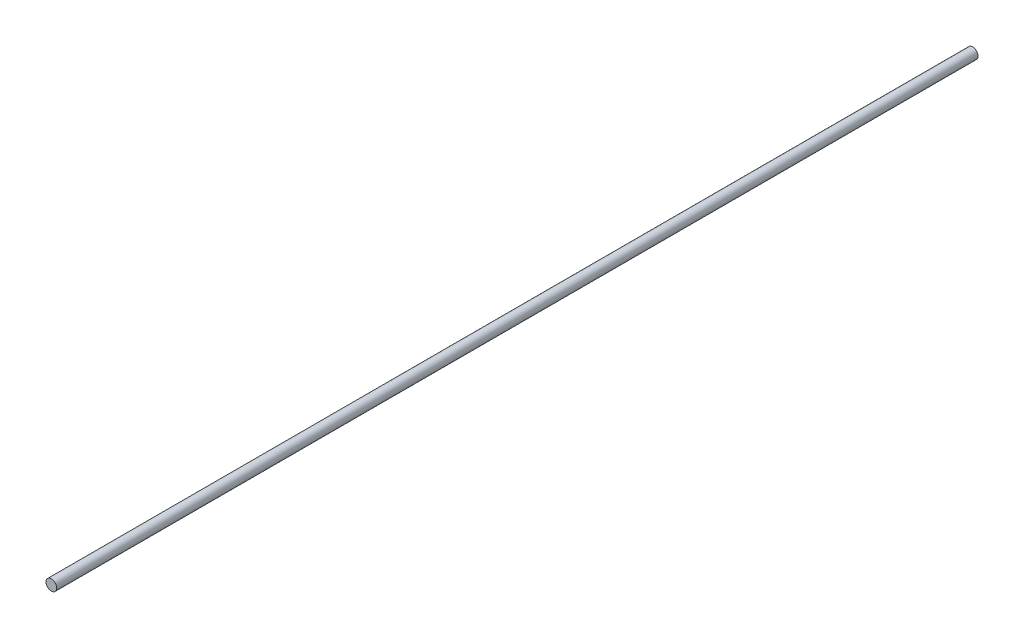
ISO-10303-21;
HEADER;
FILE_DESCRIPTION(('STEP AP214'),'2;1');
FILE_NAME('part.step','',(''),(''),'','','');
FILE_SCHEMA(('AUTOMOTIVE_DESIGN { 1 0 10303 214 1 1 1 1 }'));
ENDSEC;
DATA;
#1=APPLICATION_CONTEXT('core data for automotive mechanical design processes');
#2=APPLICATION_PROTOCOL_DEFINITION('international standard','automotive_design',2000,#1);
#3=PRODUCT_CONTEXT('',#1,'mechanical');
#4=PRODUCT('Part','Part','',(#3));
#5=PRODUCT_RELATED_PRODUCT_CATEGORY('part','',(#4));
#6=PRODUCT_DEFINITION_FORMATION('','',#4);
#7=PRODUCT_DEFINITION_CONTEXT('part definition',#1,'design');
#8=PRODUCT_DEFINITION('design','',#6,#7);
#9=PRODUCT_DEFINITION_SHAPE('','',#8);
#10=(LENGTH_UNIT() NAMED_UNIT(*) SI_UNIT(.MILLI.,.METRE.));
#11=(NAMED_UNIT(*) PLANE_ANGLE_UNIT() SI_UNIT($,.RADIAN.));
#12=(NAMED_UNIT(*) SI_UNIT($,.STERADIAN.) SOLID_ANGLE_UNIT());
#13=UNCERTAINTY_MEASURE_WITH_UNIT(LENGTH_MEASURE(1.E-05),#10,'distance_accuracy_value','');
#14=(GEOMETRIC_REPRESENTATION_CONTEXT(3) GLOBAL_UNCERTAINTY_ASSIGNED_CONTEXT((#13)) GLOBAL_UNIT_ASSIGNED_CONTEXT((#10,
#11,#12)) REPRESENTATION_CONTEXT('',''));
#15=CARTESIAN_POINT('',(0.,0.,0.));
#16=DIRECTION('',(0.,0.,1.));
#17=DIRECTION('',(1.,0.,0.));
#18=AXIS2_PLACEMENT_3D('',#15,#16,#17);
#19=CARTESIAN_POINT('',(0.,-0.196393979527816,433.07));
#20=DIRECTION('',(0.,0.,-1.));
#21=DIRECTION('',(-1.,0.,0.));
#22=AXIS2_PLACEMENT_3D('',#19,#20,#21);
#23=CYLINDRICAL_SURFACE('',#22,2.5);
#24=CARTESIAN_POINT('',(0.,-0.196393979527816,433.07));
#25=DIRECTION('',(0.,0.,1.));
#26=DIRECTION('',(1.,0.,0.));
#27=AXIS2_PLACEMENT_3D('',#24,#25,#26);
#28=CIRCLE('',#27,2.5);
#29=CARTESIAN_POINT('',(2.5,-0.196393979527816,433.07));
#30=VERTEX_POINT('',#29);
#31=EDGE_CURVE('E10',#30,#30,#28,.T.);
#32=ORIENTED_EDGE('',*,*,#31,.F.);
#33=EDGE_LOOP('',(#32));
#34=FACE_BOUND('',#33,.T.);
#35=CARTESIAN_POINT('',(0.,-0.196393979527816,0.));
#36=DIRECTION('',(0.,0.,1.));
#37=DIRECTION('',(1.,0.,0.));
#38=AXIS2_PLACEMENT_3D('',#35,#36,#37);
#39=CIRCLE('',#38,2.5);
#40=CARTESIAN_POINT('',(2.5,-0.196393979527816,0.));
#41=VERTEX_POINT('',#40);
#42=EDGE_CURVE('E38',#41,#41,#39,.T.);
#43=ORIENTED_EDGE('',*,*,#42,.T.);
#44=EDGE_LOOP('',(#43));
#45=FACE_BOUND('',#44,.T.);
#46=ADVANCED_FACE('F35',(#34,#45),#23,.T.);
#47=CARTESIAN_POINT('',(0.,-0.196393979527816,433.07));
#48=DIRECTION('',(0.,0.,1.));
#49=DIRECTION('',(1.,0.,0.));
#50=AXIS2_PLACEMENT_3D('',#47,#48,#49);
#51=PLANE('',#50);
#52=ORIENTED_EDGE('',*,*,#31,.T.);
#53=EDGE_LOOP('',(#52));
#54=FACE_BOUND('',#53,.T.);
#55=ADVANCED_FACE('F50',(#54),#51,.T.);
#56=CARTESIAN_POINT('',(0.,-0.196393979527816,0.));
#57=DIRECTION('',(0.,0.,1.));
#58=DIRECTION('',(1.,0.,0.));
#59=AXIS2_PLACEMENT_3D('',#56,#57,#58);
#60=PLANE('',#59);
#61=ORIENTED_EDGE('',*,*,#42,.F.);
#62=EDGE_LOOP('',(#61));
#63=FACE_BOUND('',#62,.T.);
#64=ADVANCED_FACE('F48',(#63),#60,.F.);
#65=CLOSED_SHELL('',(#46,#55,#64));
#66=MANIFOLD_SOLID_BREP('B2',#65);
#67=ADVANCED_BREP_SHAPE_REPRESENTATION('',(#18,#66),#14);
#68=SHAPE_DEFINITION_REPRESENTATION(#9,#67);
ENDSEC;
END-ISO-10303-21;
